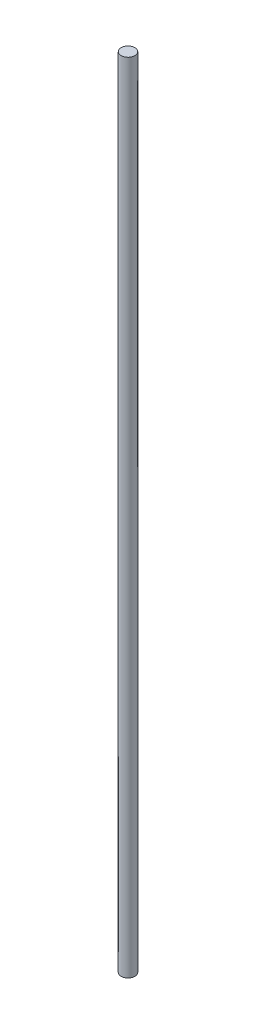
ISO-10303-21;
HEADER;
FILE_DESCRIPTION(('STEP AP214'),'2;1');
FILE_NAME('part.step','',(''),(''),'','','');
FILE_SCHEMA(('AUTOMOTIVE_DESIGN { 1 0 10303 214 1 1 1 1 }'));
ENDSEC;
DATA;
#1=APPLICATION_CONTEXT('core data for automotive mechanical design processes');
#2=APPLICATION_PROTOCOL_DEFINITION('international standard','automotive_design',2000,#1);
#3=PRODUCT_CONTEXT('',#1,'mechanical');
#4=PRODUCT('Part','Part','',(#3));
#5=PRODUCT_RELATED_PRODUCT_CATEGORY('part','',(#4));
#6=PRODUCT_DEFINITION_FORMATION('','',#4);
#7=PRODUCT_DEFINITION_CONTEXT('part definition',#1,'design');
#8=PRODUCT_DEFINITION('design','',#6,#7);
#9=PRODUCT_DEFINITION_SHAPE('','',#8);
#10=(LENGTH_UNIT() NAMED_UNIT(*) SI_UNIT(.MILLI.,.METRE.));
#11=(NAMED_UNIT(*) PLANE_ANGLE_UNIT() SI_UNIT($,.RADIAN.));
#12=(NAMED_UNIT(*) SI_UNIT($,.STERADIAN.) SOLID_ANGLE_UNIT());
#13=UNCERTAINTY_MEASURE_WITH_UNIT(LENGTH_MEASURE(1.E-05),#10,'distance_accuracy_value','');
#14=(GEOMETRIC_REPRESENTATION_CONTEXT(3) GLOBAL_UNCERTAINTY_ASSIGNED_CONTEXT((#13)) GLOBAL_UNIT_ASSIGNED_CONTEXT((#10,
#11,#12)) REPRESENTATION_CONTEXT('',''));
#15=CARTESIAN_POINT('',(0.,0.,0.));
#16=DIRECTION('',(0.,0.,1.));
#17=DIRECTION('',(1.,0.,0.));
#18=AXIS2_PLACEMENT_3D('',#15,#16,#17);
#19=CARTESIAN_POINT('',(0.,130.,0.));
#20=DIRECTION('',(0.,-1.,0.));
#21=DIRECTION('',(0.,0.,-1.));
#22=AXIS2_PLACEMENT_3D('',#19,#20,#21);
#23=CYLINDRICAL_SURFACE('',#22,1.125);
#24=CARTESIAN_POINT('',(0.,130.,0.));
#25=DIRECTION('',(0.,1.,0.));
#26=DIRECTION('',(0.,0.,1.));
#27=AXIS2_PLACEMENT_3D('',#24,#25,#26);
#28=CIRCLE('',#27,1.125);
#29=CARTESIAN_POINT('',(0.,130.,1.125));
#30=VERTEX_POINT('',#29);
#31=EDGE_CURVE('E10',#30,#30,#28,.T.);
#32=ORIENTED_EDGE('',*,*,#31,.F.);
#33=EDGE_LOOP('',(#32));
#34=FACE_BOUND('',#33,.T.);
#35=CARTESIAN_POINT('',(0.,0.,0.));
#36=DIRECTION('',(0.,1.,0.));
#37=DIRECTION('',(0.,0.,1.));
#38=AXIS2_PLACEMENT_3D('',#35,#36,#37);
#39=CIRCLE('',#38,1.125);
#40=CARTESIAN_POINT('',(0.,0.,1.125));
#41=VERTEX_POINT('',#40);
#42=EDGE_CURVE('E52',#41,#41,#39,.T.);
#43=ORIENTED_EDGE('',*,*,#42,.T.);
#44=EDGE_LOOP('',(#43));
#45=FACE_BOUND('',#44,.T.);
#46=ADVANCED_FACE('F49',(#34,#45),#23,.T.);
#47=CARTESIAN_POINT('',(0.,130.,0.));
#48=DIRECTION('',(0.,1.,0.));
#49=DIRECTION('',(0.,0.,1.));
#50=AXIS2_PLACEMENT_3D('',#47,#48,#49);
#51=PLANE('',#50);
#52=ORIENTED_EDGE('',*,*,#31,.T.);
#53=EDGE_LOOP('',(#52));
#54=FACE_BOUND('',#53,.T.);
#55=ADVANCED_FACE('F66',(#54),#51,.T.);
#56=CARTESIAN_POINT('',(0.,0.,0.));
#57=DIRECTION('',(0.,1.,0.));
#58=DIRECTION('',(0.,0.,1.));
#59=AXIS2_PLACEMENT_3D('',#56,#57,#58);
#60=PLANE('',#59);
#61=ORIENTED_EDGE('',*,*,#42,.F.);
#62=EDGE_LOOP('',(#61));
#63=FACE_BOUND('',#62,.T.);
#64=ADVANCED_FACE('F64',(#63),#60,.F.);
#65=CLOSED_SHELL('',(#46,#55,#64));
#66=MANIFOLD_SOLID_BREP('B2',#65);
#67=ADVANCED_BREP_SHAPE_REPRESENTATION('',(#18,#66),#14);
#68=SHAPE_DEFINITION_REPRESENTATION(#9,#67);
ENDSEC;
END-ISO-10303-21;
